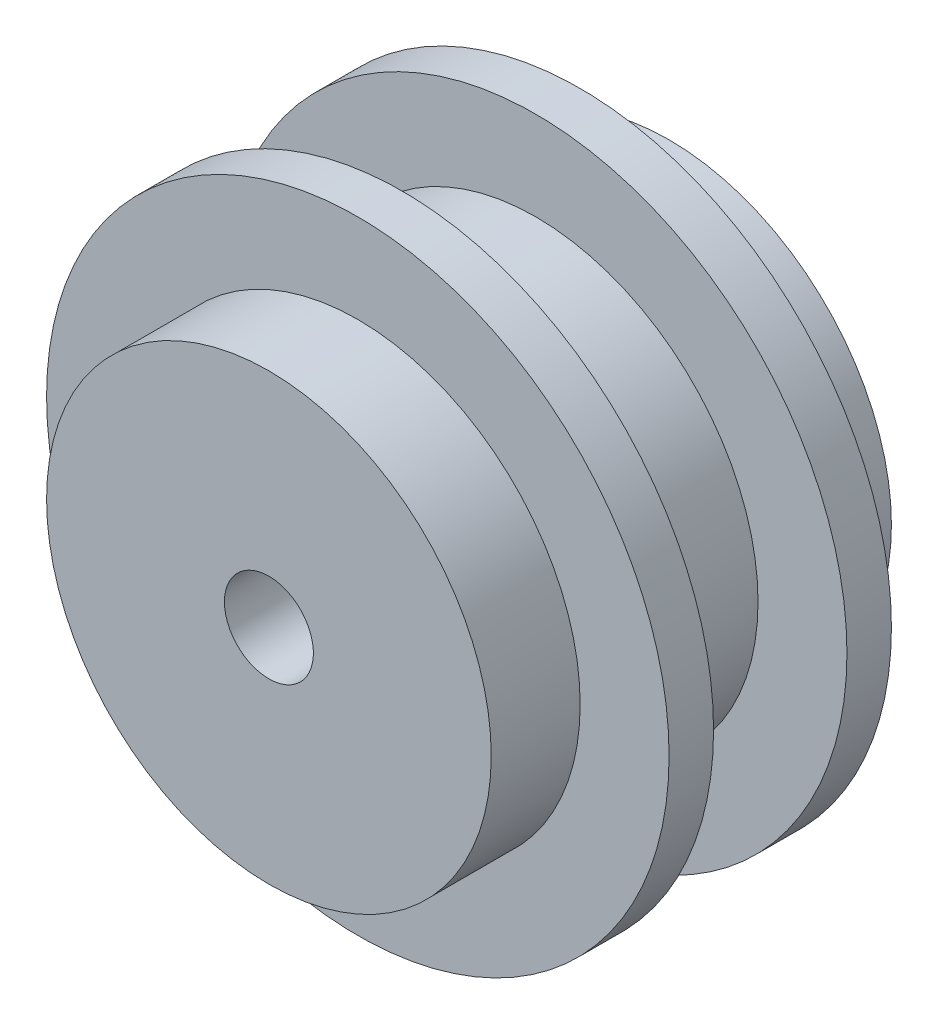
ISO-10303-21;
HEADER;
FILE_DESCRIPTION(('STEP AP214'),'2;1');
FILE_NAME('part.step','',(''),(''),'','','');
FILE_SCHEMA(('AUTOMOTIVE_DESIGN { 1 0 10303 214 1 1 1 1 }'));
ENDSEC;
DATA;
#1=APPLICATION_CONTEXT('core data for automotive mechanical design processes');
#2=APPLICATION_PROTOCOL_DEFINITION('international standard','automotive_design',2000,#1);
#3=PRODUCT_CONTEXT('',#1,'mechanical');
#4=PRODUCT('Part','Part','',(#3));
#5=PRODUCT_RELATED_PRODUCT_CATEGORY('part','',(#4));
#6=PRODUCT_DEFINITION_FORMATION('','',#4);
#7=PRODUCT_DEFINITION_CONTEXT('part definition',#1,'design');
#8=PRODUCT_DEFINITION('design','',#6,#7);
#9=PRODUCT_DEFINITION_SHAPE('','',#8);
#10=(LENGTH_UNIT() NAMED_UNIT(*) SI_UNIT(.MILLI.,.METRE.));
#11=(NAMED_UNIT(*) PLANE_ANGLE_UNIT() SI_UNIT($,.RADIAN.));
#12=(NAMED_UNIT(*) SI_UNIT($,.STERADIAN.) SOLID_ANGLE_UNIT());
#13=UNCERTAINTY_MEASURE_WITH_UNIT(LENGTH_MEASURE(1.E-05),#10,'distance_accuracy_value','');
#14=(GEOMETRIC_REPRESENTATION_CONTEXT(3) GLOBAL_UNCERTAINTY_ASSIGNED_CONTEXT((#13)) GLOBAL_UNIT_ASSIGNED_CONTEXT((#10,
#11,#12)) REPRESENTATION_CONTEXT('',''));
#15=CARTESIAN_POINT('',(0.,0.,0.));
#16=DIRECTION('',(0.,0.,1.));
#17=DIRECTION('',(1.,0.,0.));
#18=AXIS2_PLACEMENT_3D('',#15,#16,#17);
#19=CARTESIAN_POINT('',(0.,250.,0.));
#20=DIRECTION('',(0.,0.,1.));
#21=DIRECTION('',(1.,0.,0.));
#22=AXIS2_PLACEMENT_3D('',#19,#20,#21);
#23=CYLINDRICAL_SURFACE('',#22,250.);
#24=CARTESIAN_POINT('',(0.,250.,-100.));
#25=DIRECTION('',(0.,0.,1.));
#26=DIRECTION('',(1.,0.,0.));
#27=AXIS2_PLACEMENT_3D('',#24,#25,#26);
#28=CIRCLE('',#27,250.);
#29=CARTESIAN_POINT('',(250.,250.,-100.));
#30=VERTEX_POINT('',#29);
#31=EDGE_CURVE('E80',#30,#30,#28,.T.);
#32=ORIENTED_EDGE('',*,*,#31,.T.);
#33=EDGE_LOOP('',(#32));
#34=FACE_BOUND('',#33,.T.);
#35=CARTESIAN_POINT('',(0.,250.,0.));
#36=DIRECTION('',(0.,0.,1.));
#37=DIRECTION('',(1.,0.,0.));
#38=AXIS2_PLACEMENT_3D('',#35,#36,#37);
#39=CIRCLE('',#38,250.);
#40=CARTESIAN_POINT('',(250.,250.,0.));
#41=VERTEX_POINT('',#40);
#42=EDGE_CURVE('E10',#41,#41,#39,.T.);
#43=ORIENTED_EDGE('',*,*,#42,.F.);
#44=EDGE_LOOP('',(#43));
#45=FACE_BOUND('',#44,.T.);
#46=ADVANCED_FACE('F37',(#34,#45),#23,.T.);
#47=CARTESIAN_POINT('',(0.,0.,0.));
#48=DIRECTION('',(0.,0.,1.));
#49=DIRECTION('',(1.,0.,0.));
#50=AXIS2_PLACEMENT_3D('',#47,#48,#49);
#51=PLANE('',#50);
#52=CARTESIAN_POINT('',(0.,250.,0.));
#53=DIRECTION('',(0.,0.,-1.));
#54=DIRECTION('',(-1.,0.,0.));
#55=AXIS2_PLACEMENT_3D('',#52,#53,#54);
#56=CIRCLE('',#55,50.);
#57=CARTESIAN_POINT('',(-50.,250.,0.));
#58=VERTEX_POINT('',#57);
#59=EDGE_CURVE('E84',#58,#58,#56,.T.);
#60=ORIENTED_EDGE('',*,*,#59,.T.);
#61=EDGE_LOOP('',(#60));
#62=FACE_BOUND('',#61,.T.);
#63=ORIENTED_EDGE('',*,*,#42,.T.);
#64=EDGE_LOOP('',(#63));
#65=FACE_BOUND('',#64,.T.);
#66=ADVANCED_FACE('F93',(#62,#65),#51,.T.);
#67=CARTESIAN_POINT('',(0.,0.,-450.));
#68=DIRECTION('',(0.,0.,-1.));
#69=DIRECTION('',(-1.,0.,0.));
#70=AXIS2_PLACEMENT_3D('',#67,#68,#69);
#71=PLANE('',#70);
#72=CARTESIAN_POINT('',(0.,250.,-450.));
#73=DIRECTION('',(0.,0.,-1.));
#74=DIRECTION('',(-1.,0.,0.));
#75=AXIS2_PLACEMENT_3D('',#72,#73,#74);
#76=CIRCLE('',#75,50.);
#77=CARTESIAN_POINT('',(-50.,250.,-450.));
#78=VERTEX_POINT('',#77);
#79=EDGE_CURVE('E85',#78,#78,#76,.T.);
#80=ORIENTED_EDGE('',*,*,#79,.F.);
#81=EDGE_LOOP('',(#80));
#82=FACE_BOUND('',#81,.T.);
#83=CARTESIAN_POINT('',(0.,250.,-450.));
#84=DIRECTION('',(0.,0.,1.));
#85=DIRECTION('',(1.,0.,0.));
#86=AXIS2_PLACEMENT_3D('',#83,#84,#85);
#87=CIRCLE('',#86,250.);
#88=CARTESIAN_POINT('',(250.,250.,-450.));
#89=VERTEX_POINT('',#88);
#90=EDGE_CURVE('E44',#89,#89,#87,.T.);
#91=ORIENTED_EDGE('',*,*,#90,.F.);
#92=EDGE_LOOP('',(#91));
#93=FACE_BOUND('',#92,.T.);
#94=ADVANCED_FACE('F102',(#82,#93),#71,.T.);
#95=CARTESIAN_POINT('',(0.,250.,0.));
#96=DIRECTION('',(0.,0.,1.));
#97=DIRECTION('',(1.,0.,0.));
#98=AXIS2_PLACEMENT_3D('',#95,#96,#97);
#99=CYLINDRICAL_SURFACE('',#98,250.);
#100=ORIENTED_EDGE('',*,*,#90,.T.);
#101=EDGE_LOOP('',(#100));
#102=FACE_BOUND('',#101,.T.);
#103=CARTESIAN_POINT('',(0.,250.,-350.));
#104=DIRECTION('',(0.,0.,1.));
#105=DIRECTION('',(1.,0.,0.));
#106=AXIS2_PLACEMENT_3D('',#103,#104,#105);
#107=CIRCLE('',#106,250.);
#108=CARTESIAN_POINT('',(250.,250.,-350.));
#109=VERTEX_POINT('',#108);
#110=EDGE_CURVE('E49',#109,#109,#107,.T.);
#111=ORIENTED_EDGE('',*,*,#110,.F.);
#112=EDGE_LOOP('',(#111));
#113=FACE_BOUND('',#112,.T.);
#114=ADVANCED_FACE('F105',(#102,#113),#99,.T.);
#115=CARTESIAN_POINT('',(0.,-100.,-350.));
#116=DIRECTION('',(0.,0.,-1.));
#117=DIRECTION('',(-1.,0.,0.));
#118=AXIS2_PLACEMENT_3D('',#115,#116,#117);
#119=PLANE('',#118);
#120=ORIENTED_EDGE('',*,*,#110,.T.);
#121=EDGE_LOOP('',(#120));
#122=FACE_BOUND('',#121,.T.);
#123=CARTESIAN_POINT('',(0.,250.,-350.));
#124=DIRECTION('',(0.,0.,1.));
#125=DIRECTION('',(1.,0.,0.));
#126=AXIS2_PLACEMENT_3D('',#123,#124,#125);
#127=CIRCLE('',#126,350.);
#128=CARTESIAN_POINT('',(350.,250.,-350.));
#129=VERTEX_POINT('',#128);
#130=EDGE_CURVE('E54',#129,#129,#127,.T.);
#131=ORIENTED_EDGE('',*,*,#130,.F.);
#132=EDGE_LOOP('',(#131));
#133=FACE_BOUND('',#132,.T.);
#134=ADVANCED_FACE('F111',(#122,#133),#119,.T.);
#135=CARTESIAN_POINT('',(0.,250.,0.));
#136=DIRECTION('',(0.,0.,1.));
#137=DIRECTION('',(1.,0.,0.));
#138=AXIS2_PLACEMENT_3D('',#135,#136,#137);
#139=CYLINDRICAL_SURFACE('',#138,350.);
#140=ORIENTED_EDGE('',*,*,#130,.T.);
#141=EDGE_LOOP('',(#140));
#142=FACE_BOUND('',#141,.T.);
#143=CARTESIAN_POINT('',(0.,250.,-300.));
#144=DIRECTION('',(0.,0.,1.));
#145=DIRECTION('',(1.,0.,0.));
#146=AXIS2_PLACEMENT_3D('',#143,#144,#145);
#147=CIRCLE('',#146,350.);
#148=CARTESIAN_POINT('',(350.,250.,-300.));
#149=VERTEX_POINT('',#148);
#150=EDGE_CURVE('E60',#149,#149,#147,.T.);
#151=ORIENTED_EDGE('',*,*,#150,.F.);
#152=EDGE_LOOP('',(#151));
#153=FACE_BOUND('',#152,.T.);
#154=ADVANCED_FACE('F141',(#142,#153),#139,.T.);
#155=CARTESIAN_POINT('',(0.,0.,-300.));
#156=DIRECTION('',(0.,0.,1.));
#157=DIRECTION('',(1.,0.,0.));
#158=AXIS2_PLACEMENT_3D('',#155,#156,#157);
#159=PLANE('',#158);
#160=ORIENTED_EDGE('',*,*,#150,.T.);
#161=EDGE_LOOP('',(#160));
#162=FACE_BOUND('',#161,.T.);
#163=CARTESIAN_POINT('',(0.,250.,-300.));
#164=DIRECTION('',(0.,0.,1.));
#165=DIRECTION('',(1.,0.,0.));
#166=AXIS2_PLACEMENT_3D('',#163,#164,#165);
#167=CIRCLE('',#166,250.);
#168=CARTESIAN_POINT('',(250.,250.,-300.));
#169=VERTEX_POINT('',#168);
#170=EDGE_CURVE('E64',#169,#169,#167,.T.);
#171=ORIENTED_EDGE('',*,*,#170,.F.);
#172=EDGE_LOOP('',(#171));
#173=FACE_BOUND('',#172,.T.);
#174=ADVANCED_FACE('F137',(#162,#173),#159,.T.);
#175=CARTESIAN_POINT('',(0.,250.,0.));
#176=DIRECTION('',(0.,0.,1.));
#177=DIRECTION('',(1.,0.,0.));
#178=AXIS2_PLACEMENT_3D('',#175,#176,#177);
#179=CYLINDRICAL_SURFACE('',#178,250.);
#180=ORIENTED_EDGE('',*,*,#170,.T.);
#181=EDGE_LOOP('',(#180));
#182=FACE_BOUND('',#181,.T.);
#183=CARTESIAN_POINT('',(0.,250.,-150.));
#184=DIRECTION('',(0.,0.,1.));
#185=DIRECTION('',(1.,0.,0.));
#186=AXIS2_PLACEMENT_3D('',#183,#184,#185);
#187=CIRCLE('',#186,250.);
#188=CARTESIAN_POINT('',(250.,250.,-150.));
#189=VERTEX_POINT('',#188);
#190=EDGE_CURVE('E68',#189,#189,#187,.T.);
#191=ORIENTED_EDGE('',*,*,#190,.F.);
#192=EDGE_LOOP('',(#191));
#193=FACE_BOUND('',#192,.T.);
#194=ADVANCED_FACE('F133',(#182,#193),#179,.T.);
#195=CARTESIAN_POINT('',(0.,-100.,-150.));
#196=DIRECTION('',(0.,0.,-1.));
#197=DIRECTION('',(-1.,0.,0.));
#198=AXIS2_PLACEMENT_3D('',#195,#196,#197);
#199=PLANE('',#198);
#200=ORIENTED_EDGE('',*,*,#190,.T.);
#201=EDGE_LOOP('',(#200));
#202=FACE_BOUND('',#201,.T.);
#203=CARTESIAN_POINT('',(0.,250.,-150.));
#204=DIRECTION('',(0.,0.,1.));
#205=DIRECTION('',(1.,0.,0.));
#206=AXIS2_PLACEMENT_3D('',#203,#204,#205);
#207=CIRCLE('',#206,350.);
#208=CARTESIAN_POINT('',(350.,250.,-150.));
#209=VERTEX_POINT('',#208);
#210=EDGE_CURVE('E72',#209,#209,#207,.T.);
#211=ORIENTED_EDGE('',*,*,#210,.F.);
#212=EDGE_LOOP('',(#211));
#213=FACE_BOUND('',#212,.T.);
#214=ADVANCED_FACE('F127',(#202,#213),#199,.T.);
#215=CARTESIAN_POINT('',(0.,250.,0.));
#216=DIRECTION('',(0.,0.,1.));
#217=DIRECTION('',(1.,0.,0.));
#218=AXIS2_PLACEMENT_3D('',#215,#216,#217);
#219=CYLINDRICAL_SURFACE('',#218,350.);
#220=ORIENTED_EDGE('',*,*,#210,.T.);
#221=EDGE_LOOP('',(#220));
#222=FACE_BOUND('',#221,.T.);
#223=CARTESIAN_POINT('',(0.,250.,-100.));
#224=DIRECTION('',(0.,0.,1.));
#225=DIRECTION('',(1.,0.,0.));
#226=AXIS2_PLACEMENT_3D('',#223,#224,#225);
#227=CIRCLE('',#226,350.);
#228=CARTESIAN_POINT('',(350.,250.,-100.));
#229=VERTEX_POINT('',#228);
#230=EDGE_CURVE('E76',#229,#229,#227,.T.);
#231=ORIENTED_EDGE('',*,*,#230,.F.);
#232=EDGE_LOOP('',(#231));
#233=FACE_BOUND('',#232,.T.);
#234=ADVANCED_FACE('F121',(#222,#233),#219,.T.);
#235=CARTESIAN_POINT('',(0.,0.,-100.));
#236=DIRECTION('',(0.,0.,1.));
#237=DIRECTION('',(1.,0.,0.));
#238=AXIS2_PLACEMENT_3D('',#235,#236,#237);
#239=PLANE('',#238);
#240=ORIENTED_EDGE('',*,*,#230,.T.);
#241=EDGE_LOOP('',(#240));
#242=FACE_BOUND('',#241,.T.);
#243=ORIENTED_EDGE('',*,*,#31,.F.);
#244=EDGE_LOOP('',(#243));
#245=FACE_BOUND('',#244,.T.);
#246=ADVANCED_FACE('F98',(#242,#245),#239,.T.);
#247=CARTESIAN_POINT('',(0.,250.,0.));
#248=DIRECTION('',(0.,0.,-1.));
#249=DIRECTION('',(-1.,0.,0.));
#250=AXIS2_PLACEMENT_3D('',#247,#248,#249);
#251=CYLINDRICAL_SURFACE('',#250,50.);
#252=ORIENTED_EDGE('',*,*,#59,.F.);
#253=EDGE_LOOP('',(#252));
#254=FACE_BOUND('',#253,.T.);
#255=ORIENTED_EDGE('',*,*,#79,.T.);
#256=EDGE_LOOP('',(#255));
#257=FACE_BOUND('',#256,.T.);
#258=ADVANCED_FACE('F95',(#254,#257),#251,.F.);
#259=CLOSED_SHELL('',(#46,#66,#94,#114,#134,#154,#174,#194,#214,#234,#246,#258));
#260=MANIFOLD_SOLID_BREP('B2',#259);
#261=ADVANCED_BREP_SHAPE_REPRESENTATION('',(#18,#260),#14);
#262=SHAPE_DEFINITION_REPRESENTATION(#9,#261);
ENDSEC;
END-ISO-10303-21;
